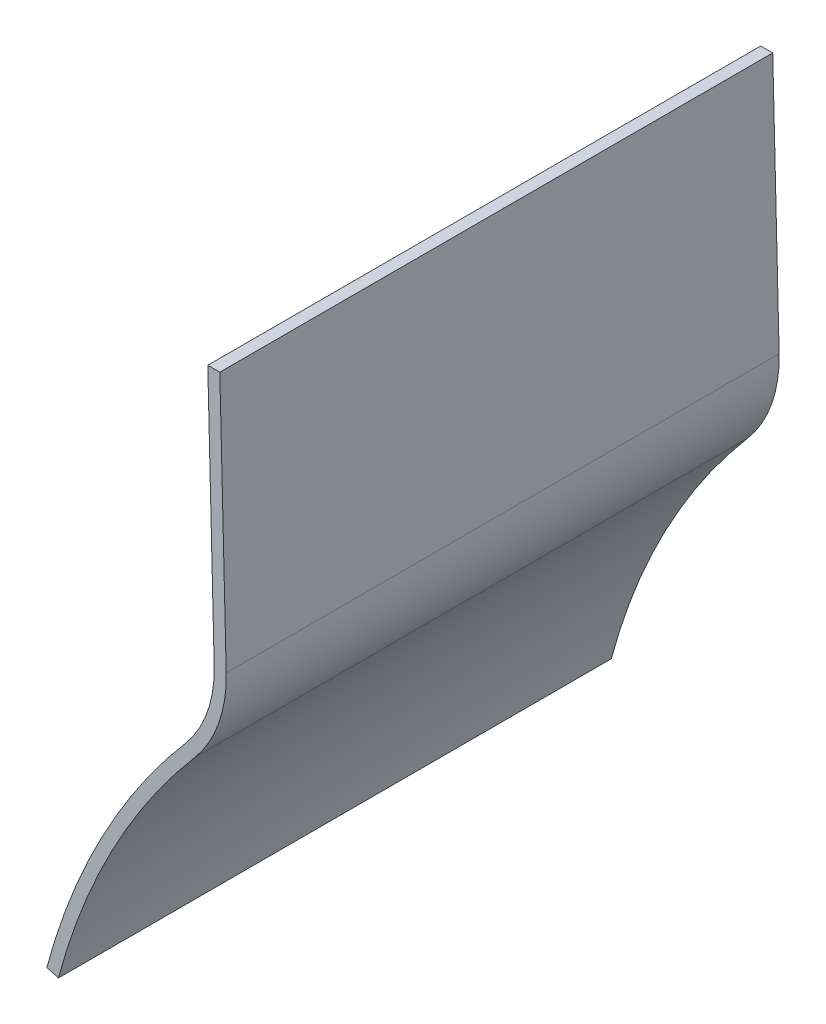
ISO-10303-21;
HEADER;
FILE_DESCRIPTION(('STEP AP214'),'2;1');
FILE_NAME('part.step','',(''),(''),'','','');
FILE_SCHEMA(('AUTOMOTIVE_DESIGN { 1 0 10303 214 1 1 1 1 }'));
ENDSEC;
DATA;
#1=APPLICATION_CONTEXT('core data for automotive mechanical design processes');
#2=APPLICATION_PROTOCOL_DEFINITION('international standard','automotive_design',2000,#1);
#3=PRODUCT_CONTEXT('',#1,'mechanical');
#4=PRODUCT('Part','Part','',(#3));
#5=PRODUCT_RELATED_PRODUCT_CATEGORY('part','',(#4));
#6=PRODUCT_DEFINITION_FORMATION('','',#4);
#7=PRODUCT_DEFINITION_CONTEXT('part definition',#1,'design');
#8=PRODUCT_DEFINITION('design','',#6,#7);
#9=PRODUCT_DEFINITION_SHAPE('','',#8);
#10=(LENGTH_UNIT() NAMED_UNIT(*) SI_UNIT(.MILLI.,.METRE.));
#11=(NAMED_UNIT(*) PLANE_ANGLE_UNIT() SI_UNIT($,.RADIAN.));
#12=(NAMED_UNIT(*) SI_UNIT($,.STERADIAN.) SOLID_ANGLE_UNIT());
#13=UNCERTAINTY_MEASURE_WITH_UNIT(LENGTH_MEASURE(1.E-05),#10,'distance_accuracy_value','');
#14=(GEOMETRIC_REPRESENTATION_CONTEXT(3) GLOBAL_UNCERTAINTY_ASSIGNED_CONTEXT((#13)) GLOBAL_UNIT_ASSIGNED_CONTEXT((#10,
#11,#12)) REPRESENTATION_CONTEXT('',''));
#15=CARTESIAN_POINT('',(0.,0.,0.));
#16=DIRECTION('',(0.,0.,1.));
#17=DIRECTION('',(1.,0.,0.));
#18=AXIS2_PLACEMENT_3D('',#15,#16,#17);
#19=CARTESIAN_POINT('',(3079.9311420539,1803.29085628312,460.));
#20=DIRECTION('',(0.,0.,-1.));
#21=DIRECTION('',(-1.,0.,0.));
#22=AXIS2_PLACEMENT_3D('',#19,#20,#21);
#23=CYLINDRICAL_SURFACE('',#22,549.387659983749);
#24=CARTESIAN_POINT('',(3079.9311420539,1803.29085628312,0.));
#25=DIRECTION('',(0.,0.,-1.));
#26=DIRECTION('',(1.,0.,0.));
#27=AXIS2_PLACEMENT_3D('',#24,#25,#26);
#28=CIRCLE('',#27,549.387659983749);
#29=CARTESIAN_POINT('',(2549.10079832221,1944.8745669144,0.));
#30=VERTEX_POINT('',#29);
#31=CARTESIAN_POINT('',(2662.36569843274,2160.31452669712,0.));
#32=VERTEX_POINT('',#31);
#33=EDGE_CURVE('E128',#30,#32,#28,.T.);
#34=ORIENTED_EDGE('',*,*,#33,.T.);
#35=DIRECTION('',(0.,0.,-1.));
#36=VECTOR('',#35,1.);
#37=CARTESIAN_POINT('',(2662.36569843274,2160.31452669712,460.));
#38=LINE('',#37,#36);
#39=CARTESIAN_POINT('',(2662.36569843274,2160.31452669712,460.));
#40=VERTEX_POINT('',#39);
#41=EDGE_CURVE('E11',#40,#32,#38,.T.);
#42=ORIENTED_EDGE('',*,*,#41,.F.);
#43=CARTESIAN_POINT('',(3079.9311420539,1803.29085628312,460.));
#44=DIRECTION('',(0.,0.,-1.));
#45=DIRECTION('',(1.,0.,0.));
#46=AXIS2_PLACEMENT_3D('',#43,#44,#45);
#47=CIRCLE('',#46,549.387659983749);
#48=CARTESIAN_POINT('',(2549.10079832221,1944.8745669144,460.));
#49=VERTEX_POINT('',#48);
#50=EDGE_CURVE('E142',#49,#40,#47,.T.);
#51=ORIENTED_EDGE('',*,*,#50,.F.);
#52=DIRECTION('',(0.,0.,-1.));
#53=VECTOR('',#52,1.);
#54=CARTESIAN_POINT('',(2549.10079832221,1944.8745669144,460.));
#55=LINE('',#54,#53);
#56=EDGE_CURVE('E124',#49,#30,#55,.T.);
#57=ORIENTED_EDGE('',*,*,#56,.T.);
#58=EDGE_LOOP('',(#34,#42,#51,#57));
#59=FACE_BOUND('',#58,.T.);
#60=ADVANCED_FACE('F32',(#59),#23,.F.);
#61=CARTESIAN_POINT('',(2578.85260970876,2231.71926078021,460.));
#62=DIRECTION('',(0.,0.,-1.));
#63=DIRECTION('',(-1.,0.,0.));
#64=AXIS2_PLACEMENT_3D('',#61,#62,#63);
#65=CYLINDRICAL_SURFACE('',#64,109.877531996749);
#66=CARTESIAN_POINT('',(2578.85260970876,2231.71926078021,0.));
#67=DIRECTION('',(0.,0.,1.));
#68=DIRECTION('',(1.,0.,0.));
#69=AXIS2_PLACEMENT_3D('',#66,#67,#68);
#70=CIRCLE('',#69,109.877531996749);
#71=CARTESIAN_POINT('',(2688.69602440582,2234.45719529106,0.));
#72=VERTEX_POINT('',#71);
#73=EDGE_CURVE('E131',#32,#72,#70,.T.);
#74=ORIENTED_EDGE('',*,*,#73,.T.);
#75=DIRECTION('',(0.,0.,-1.));
#76=VECTOR('',#75,1.);
#77=CARTESIAN_POINT('',(2688.69602440582,2234.45719529106,460.));
#78=LINE('',#77,#76);
#79=CARTESIAN_POINT('',(2688.69602440582,2234.45719529106,460.));
#80=VERTEX_POINT('',#79);
#81=EDGE_CURVE('E40',#80,#72,#78,.T.);
#82=ORIENTED_EDGE('',*,*,#81,.F.);
#83=CARTESIAN_POINT('',(2578.85260970876,2231.71926078021,460.));
#84=DIRECTION('',(0.,0.,1.));
#85=DIRECTION('',(1.,0.,0.));
#86=AXIS2_PLACEMENT_3D('',#83,#84,#85);
#87=CIRCLE('',#86,109.877531996749);
#88=EDGE_CURVE('E91',#40,#80,#87,.T.);
#89=ORIENTED_EDGE('',*,*,#88,.F.);
#90=ORIENTED_EDGE('',*,*,#41,.T.);
#91=EDGE_LOOP('',(#74,#82,#89,#90));
#92=FACE_BOUND('',#91,.T.);
#93=ADVANCED_FACE('F177',(#92),#65,.T.);
#94=CARTESIAN_POINT('',(2683.36118481554,2448.48605359148,460.));
#95=DIRECTION('',(-0.99968949703305,-0.0249180561402349,0.));
#96=DIRECTION('',(0.0249180561402349,-0.99968949703305,0.));
#97=AXIS2_PLACEMENT_3D('',#94,#95,#96);
#98=PLANE('',#97);
#99=DIRECTION('',(-0.0249180561402349,0.99968949703305,0.));
#100=VECTOR('',#99,1.);
#101=CARTESIAN_POINT('',(2683.36118481554,2448.48605359148,0.));
#102=LINE('',#101,#100);
#103=CARTESIAN_POINT('',(2683.36118481554,2448.48605359148,0.));
#104=VERTEX_POINT('',#103);
#105=EDGE_CURVE('E133',#72,#104,#102,.T.);
#106=ORIENTED_EDGE('',*,*,#105,.T.);
#107=DIRECTION('',(0.,0.,-1.));
#108=VECTOR('',#107,1.);
#109=CARTESIAN_POINT('',(2683.36118481554,2448.48605359148,460.));
#110=LINE('',#109,#108);
#111=CARTESIAN_POINT('',(2683.36118481554,2448.48605359148,460.));
#112=VERTEX_POINT('',#111);
#113=EDGE_CURVE('E149',#112,#104,#110,.T.);
#114=ORIENTED_EDGE('',*,*,#113,.F.);
#115=DIRECTION('',(-0.0249180561402349,0.99968949703305,0.));
#116=VECTOR('',#115,1.);
#117=CARTESIAN_POINT('',(2683.36118481554,2448.48605359148,460.));
#118=LINE('',#117,#116);
#119=EDGE_CURVE('E157',#80,#112,#118,.T.);
#120=ORIENTED_EDGE('',*,*,#119,.F.);
#121=ORIENTED_EDGE('',*,*,#81,.T.);
#122=EDGE_LOOP('',(#106,#114,#120,#121));
#123=FACE_BOUND('',#122,.T.);
#124=ADVANCED_FACE('F155',(#123),#98,.F.);
#125=CARTESIAN_POINT('',(2673.35807882145,2448.48605359148,460.));
#126=DIRECTION('',(0.,-1.,0.));
#127=DIRECTION('',(0.,0.,-1.));
#128=AXIS2_PLACEMENT_3D('',#125,#126,#127);
#129=PLANE('',#128);
#130=DIRECTION('',(-1.,0.,0.));
#131=VECTOR('',#130,1.);
#132=CARTESIAN_POINT('',(2673.35807882145,2448.48605359148,0.));
#133=LINE('',#132,#131);
#134=CARTESIAN_POINT('',(2673.35807882145,2448.48605359148,0.));
#135=VERTEX_POINT('',#134);
#136=EDGE_CURVE('E135',#104,#135,#133,.T.);
#137=ORIENTED_EDGE('',*,*,#136,.T.);
#138=DIRECTION('',(0.,0.,-1.));
#139=VECTOR('',#138,1.);
#140=CARTESIAN_POINT('',(2673.35807882145,2448.48605359148,460.));
#141=LINE('',#140,#139);
#142=CARTESIAN_POINT('',(2673.35807882145,2448.48605359148,460.));
#143=VERTEX_POINT('',#142);
#144=EDGE_CURVE('E146',#143,#135,#141,.T.);
#145=ORIENTED_EDGE('',*,*,#144,.F.);
#146=DIRECTION('',(-1.,0.,0.));
#147=VECTOR('',#146,1.);
#148=CARTESIAN_POINT('',(2673.35807882145,2448.48605359148,460.));
#149=LINE('',#148,#147);
#150=EDGE_CURVE('E169',#112,#143,#149,.T.);
#151=ORIENTED_EDGE('',*,*,#150,.F.);
#152=ORIENTED_EDGE('',*,*,#113,.T.);
#153=EDGE_LOOP('',(#137,#145,#151,#152));
#154=FACE_BOUND('',#153,.T.);
#155=ADVANCED_FACE('F165',(#154),#129,.F.);
#156=CARTESIAN_POINT('',(2673.35807882145,2448.48605359148,460.));
#157=DIRECTION('',(0.99968949703305,0.0249180561402345,0.));
#158=DIRECTION('',(-0.0249180561402345,0.99968949703305,0.));
#159=AXIS2_PLACEMENT_3D('',#156,#157,#158);
#160=PLANE('',#159);
#161=DIRECTION('',(0.0249180561402345,-0.99968949703305,0.));
#162=VECTOR('',#161,1.);
#163=CARTESIAN_POINT('',(2673.35807882145,2448.48605359148,0.));
#164=LINE('',#163,#162);
#165=CARTESIAN_POINT('',(2678.69912943549,2234.20801472965,0.));
#166=VERTEX_POINT('',#165);
#167=EDGE_CURVE('E137',#135,#166,#164,.T.);
#168=ORIENTED_EDGE('',*,*,#167,.T.);
#169=DIRECTION('',(0.,0.,-1.));
#170=VECTOR('',#169,1.);
#171=CARTESIAN_POINT('',(2678.69912943549,2234.20801472965,460.));
#172=LINE('',#171,#170);
#173=CARTESIAN_POINT('',(2678.69912943549,2234.20801472965,460.));
#174=VERTEX_POINT('',#173);
#175=EDGE_CURVE('E119',#174,#166,#172,.T.);
#176=ORIENTED_EDGE('',*,*,#175,.F.);
#177=DIRECTION('',(0.0249180561402345,-0.99968949703305,0.));
#178=VECTOR('',#177,1.);
#179=CARTESIAN_POINT('',(2673.35807882145,2448.48605359148,460.));
#180=LINE('',#179,#178);
#181=EDGE_CURVE('E110',#143,#174,#180,.T.);
#182=ORIENTED_EDGE('',*,*,#181,.F.);
#183=ORIENTED_EDGE('',*,*,#144,.T.);
#184=EDGE_LOOP('',(#168,#176,#182,#183));
#185=FACE_BOUND('',#184,.T.);
#186=ADVANCED_FACE('F168',(#185),#160,.F.);
#187=CARTESIAN_POINT('',(2578.85260970876,2231.71926078021,460.));
#188=DIRECTION('',(0.,0.,-1.));
#189=DIRECTION('',(-1.,0.,0.));
#190=AXIS2_PLACEMENT_3D('',#187,#188,#189);
#191=CYLINDRICAL_SURFACE('',#190,99.8775319967491);
#192=CARTESIAN_POINT('',(2578.85260970876,2231.71926078021,0.));
#193=DIRECTION('',(0.,0.,-1.));
#194=DIRECTION('',(1.,0.,0.));
#195=AXIS2_PLACEMENT_3D('',#192,#193,#194);
#196=CIRCLE('',#195,99.8775319967491);
#197=CARTESIAN_POINT('',(2654.76513740752,2166.8131013179,0.));
#198=VERTEX_POINT('',#197);
#199=EDGE_CURVE('E118',#166,#198,#196,.T.);
#200=ORIENTED_EDGE('',*,*,#199,.T.);
#201=DIRECTION('',(0.,0.,-1.));
#202=VECTOR('',#201,1.);
#203=CARTESIAN_POINT('',(2654.76513740752,2166.8131013179,460.));
#204=LINE('',#203,#202);
#205=CARTESIAN_POINT('',(2654.76513740752,2166.8131013179,460.));
#206=VERTEX_POINT('',#205);
#207=EDGE_CURVE('E115',#206,#198,#204,.T.);
#208=ORIENTED_EDGE('',*,*,#207,.F.);
#209=CARTESIAN_POINT('',(2578.85260970876,2231.71926078021,460.));
#210=DIRECTION('',(0.,0.,-1.));
#211=DIRECTION('',(1.,0.,0.));
#212=AXIS2_PLACEMENT_3D('',#209,#210,#211);
#213=CIRCLE('',#212,99.8775319967491);
#214=EDGE_CURVE('E104',#174,#206,#213,.T.);
#215=ORIENTED_EDGE('',*,*,#214,.F.);
#216=ORIENTED_EDGE('',*,*,#175,.T.);
#217=EDGE_LOOP('',(#200,#208,#215,#216));
#218=FACE_BOUND('',#217,.T.);
#219=ADVANCED_FACE('F116',(#218),#191,.F.);
#220=CARTESIAN_POINT('',(3079.9311420539,1803.29085628312,460.));
#221=DIRECTION('',(0.,0.,-1.));
#222=DIRECTION('',(-1.,0.,0.));
#223=AXIS2_PLACEMENT_3D('',#220,#221,#222);
#224=CYLINDRICAL_SURFACE('',#223,559.387659983748);
#225=CARTESIAN_POINT('',(3079.9311420539,1803.29085628312,0.));
#226=DIRECTION('',(0.,0.,1.));
#227=DIRECTION('',(1.,0.,0.));
#228=AXIS2_PLACEMENT_3D('',#225,#226,#227);
#229=CIRCLE('',#228,559.387659983748);
#230=CARTESIAN_POINT('',(2539.48570451849,1947.62824987624,0.));
#231=VERTEX_POINT('',#230);
#232=EDGE_CURVE('E77',#198,#231,#229,.T.);
#233=ORIENTED_EDGE('',*,*,#232,.T.);
#234=DIRECTION('',(0.,0.,-1.));
#235=VECTOR('',#234,1.);
#236=CARTESIAN_POINT('',(2539.48570451849,1947.62824987624,460.));
#237=LINE('',#236,#235);
#238=CARTESIAN_POINT('',(2539.48570451849,1947.62824987624,460.));
#239=VERTEX_POINT('',#238);
#240=EDGE_CURVE('E120',#239,#231,#237,.T.);
#241=ORIENTED_EDGE('',*,*,#240,.F.);
#242=CARTESIAN_POINT('',(3079.9311420539,1803.29085628312,460.));
#243=DIRECTION('',(0.,0.,1.));
#244=DIRECTION('',(1.,0.,0.));
#245=AXIS2_PLACEMENT_3D('',#242,#243,#244);
#246=CIRCLE('',#245,559.387659983748);
#247=EDGE_CURVE('E108',#206,#239,#246,.T.);
#248=ORIENTED_EDGE('',*,*,#247,.F.);
#249=ORIENTED_EDGE('',*,*,#207,.T.);
#250=EDGE_LOOP('',(#233,#241,#248,#249));
#251=FACE_BOUND('',#250,.T.);
#252=ADVANCED_FACE('F122',(#251),#224,.T.);
#253=CARTESIAN_POINT('',(2549.10079832221,1944.8745669144,460.));
#254=DIRECTION('',(0.275323148667392,0.961351737819136,0.));
#255=DIRECTION('',(-0.961351737819136,0.275323148667392,0.));
#256=AXIS2_PLACEMENT_3D('',#253,#254,#255);
#257=PLANE('',#256);
#258=DIRECTION('',(0.961351737819136,-0.275323148667392,0.));
#259=VECTOR('',#258,1.);
#260=CARTESIAN_POINT('',(2549.10079832221,1944.8745669144,0.));
#261=LINE('',#260,#259);
#262=EDGE_CURVE('E83',#231,#30,#261,.T.);
#263=ORIENTED_EDGE('',*,*,#262,.T.);
#264=ORIENTED_EDGE('',*,*,#56,.F.);
#265=DIRECTION('',(0.961351737819136,-0.275323148667392,0.));
#266=VECTOR('',#265,1.);
#267=CARTESIAN_POINT('',(2549.10079832221,1944.8745669144,460.));
#268=LINE('',#267,#266);
#269=EDGE_CURVE('E48',#239,#49,#268,.T.);
#270=ORIENTED_EDGE('',*,*,#269,.F.);
#271=ORIENTED_EDGE('',*,*,#240,.T.);
#272=EDGE_LOOP('',(#263,#264,#270,#271));
#273=FACE_BOUND('',#272,.T.);
#274=ADVANCED_FACE('F193',(#273),#257,.F.);
#275=CARTESIAN_POINT('',(3079.9311420539,1803.29085628312,460.));
#276=DIRECTION('',(0.,0.,1.));
#277=DIRECTION('',(1.,0.,0.));
#278=AXIS2_PLACEMENT_3D('',#275,#276,#277);
#279=PLANE('',#278);
#280=ORIENTED_EDGE('',*,*,#50,.T.);
#281=ORIENTED_EDGE('',*,*,#88,.T.);
#282=ORIENTED_EDGE('',*,*,#119,.T.);
#283=ORIENTED_EDGE('',*,*,#150,.T.);
#284=ORIENTED_EDGE('',*,*,#181,.T.);
#285=ORIENTED_EDGE('',*,*,#214,.T.);
#286=ORIENTED_EDGE('',*,*,#247,.T.);
#287=ORIENTED_EDGE('',*,*,#269,.T.);
#288=EDGE_LOOP('',(#280,#281,#282,#283,#284,#285,#286,#287));
#289=FACE_BOUND('',#288,.T.);
#290=ADVANCED_FACE('F106',(#289),#279,.T.);
#291=CARTESIAN_POINT('',(3079.9311420539,1803.29085628312,0.));
#292=DIRECTION('',(0.,0.,1.));
#293=DIRECTION('',(1.,0.,0.));
#294=AXIS2_PLACEMENT_3D('',#291,#292,#293);
#295=PLANE('',#294);
#296=ORIENTED_EDGE('',*,*,#33,.F.);
#297=ORIENTED_EDGE('',*,*,#262,.F.);
#298=ORIENTED_EDGE('',*,*,#232,.F.);
#299=ORIENTED_EDGE('',*,*,#199,.F.);
#300=ORIENTED_EDGE('',*,*,#167,.F.);
#301=ORIENTED_EDGE('',*,*,#136,.F.);
#302=ORIENTED_EDGE('',*,*,#105,.F.);
#303=ORIENTED_EDGE('',*,*,#73,.F.);
#304=EDGE_LOOP('',(#296,#297,#298,#299,#300,#301,#302,#303));
#305=FACE_BOUND('',#304,.T.);
#306=ADVANCED_FACE('F161',(#305),#295,.F.);
#307=CLOSED_SHELL('',(#60,#93,#124,#155,#186,#219,#252,#274,#290,#306));
#308=MANIFOLD_SOLID_BREP('B2',#307);
#309=ADVANCED_BREP_SHAPE_REPRESENTATION('',(#18,#308),#14);
#310=SHAPE_DEFINITION_REPRESENTATION(#9,#309);
ENDSEC;
END-ISO-10303-21;
